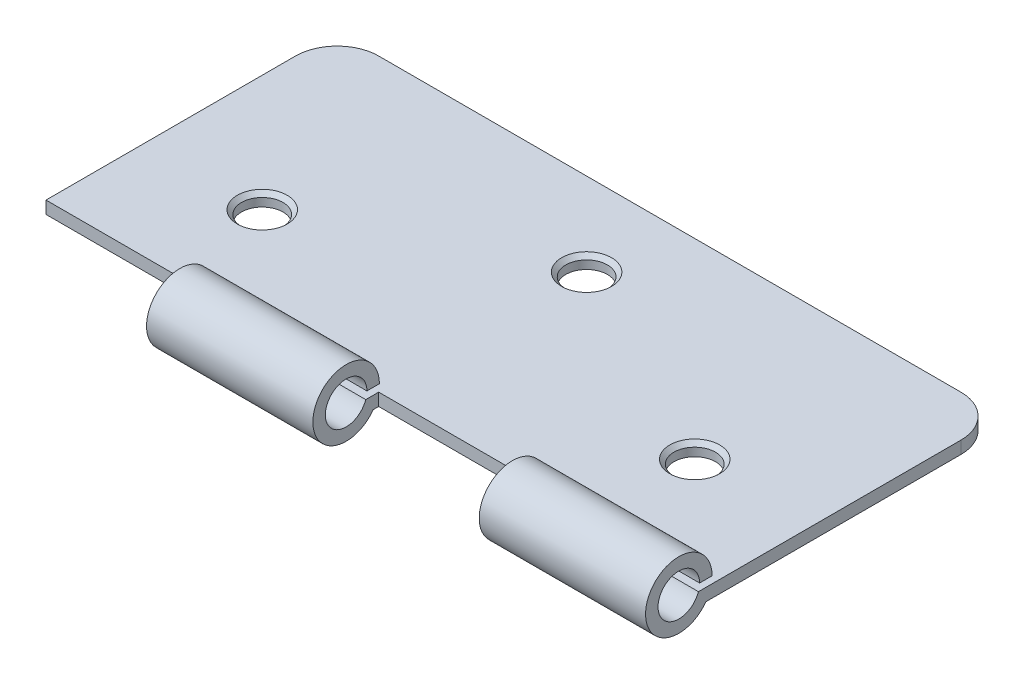
ISO-10303-21;
HEADER;
FILE_DESCRIPTION(('STEP AP214'),'2;1');
FILE_NAME('part.step','',(''),(''),'','','');
FILE_SCHEMA(('AUTOMOTIVE_DESIGN { 1 0 10303 214 1 1 1 1 }'));
ENDSEC;
DATA;
#1=APPLICATION_CONTEXT('core data for automotive mechanical design processes');
#2=APPLICATION_PROTOCOL_DEFINITION('international standard','automotive_design',2000,#1);
#3=PRODUCT_CONTEXT('',#1,'mechanical');
#4=PRODUCT('Part','Part','',(#3));
#5=PRODUCT_RELATED_PRODUCT_CATEGORY('part','',(#4));
#6=PRODUCT_DEFINITION_FORMATION('','',#4);
#7=PRODUCT_DEFINITION_CONTEXT('part definition',#1,'design');
#8=PRODUCT_DEFINITION('design','',#6,#7);
#9=PRODUCT_DEFINITION_SHAPE('','',#8);
#10=(LENGTH_UNIT() NAMED_UNIT(*) SI_UNIT(.MILLI.,.METRE.));
#11=(NAMED_UNIT(*) PLANE_ANGLE_UNIT() SI_UNIT($,.RADIAN.));
#12=(NAMED_UNIT(*) SI_UNIT($,.STERADIAN.) SOLID_ANGLE_UNIT());
#13=UNCERTAINTY_MEASURE_WITH_UNIT(LENGTH_MEASURE(1.E-05),#10,'distance_accuracy_value','');
#14=(GEOMETRIC_REPRESENTATION_CONTEXT(3) GLOBAL_UNCERTAINTY_ASSIGNED_CONTEXT((#13)) GLOBAL_UNIT_ASSIGNED_CONTEXT((#10,
#11,#12)) REPRESENTATION_CONTEXT('',''));
#15=CARTESIAN_POINT('',(0.,0.,0.));
#16=DIRECTION('',(0.,0.,1.));
#17=DIRECTION('',(1.,0.,0.));
#18=AXIS2_PLACEMENT_3D('',#15,#16,#17);
#19=CARTESIAN_POINT('',(-40.,1.5,17.5));
#20=DIRECTION('',(0.,0.,-1.));
#21=DIRECTION('',(-1.,0.,0.));
#22=AXIS2_PLACEMENT_3D('',#19,#20,#21);
#23=PLANE('',#22);
#24=DIRECTION('',(0.,1.,0.));
#25=VECTOR('',#24,1.);
#26=CARTESIAN_POINT('',(-20.,0.,17.5));
#27=LINE('',#26,#25);
#28=CARTESIAN_POINT('',(-20.,0.,17.5));
#29=VERTEX_POINT('',#28);
#30=CARTESIAN_POINT('',(-20.,1.5,17.5));
#31=VERTEX_POINT('',#30);
#32=EDGE_CURVE('E61',#29,#31,#27,.T.);
#33=ORIENTED_EDGE('',*,*,#32,.T.);
#34=DIRECTION('',(1.,0.,0.));
#35=VECTOR('',#34,1.);
#36=CARTESIAN_POINT('',(-40.,1.5,17.5));
#37=LINE('',#36,#35);
#38=CARTESIAN_POINT('',(-40.,1.5,17.5));
#39=VERTEX_POINT('',#38);
#40=EDGE_CURVE('E176',#39,#31,#37,.T.);
#41=ORIENTED_EDGE('',*,*,#40,.F.);
#42=DIRECTION('',(0.,-1.,0.));
#43=VECTOR('',#42,1.);
#44=CARTESIAN_POINT('',(-40.,1.5,17.5));
#45=LINE('',#44,#43);
#46=CARTESIAN_POINT('',(-40.,0.,17.5));
#47=VERTEX_POINT('',#46);
#48=EDGE_CURVE('E256',#39,#47,#45,.T.);
#49=ORIENTED_EDGE('',*,*,#48,.T.);
#50=DIRECTION('',(1.,0.,0.));
#51=VECTOR('',#50,1.);
#52=CARTESIAN_POINT('',(-40.,0.,17.5));
#53=LINE('',#52,#51);
#54=EDGE_CURVE('E247',#47,#29,#53,.T.);
#55=ORIENTED_EDGE('',*,*,#54,.T.);
#56=EDGE_LOOP('',(#33,#41,#49,#55));
#57=FACE_BOUND('',#56,.T.);
#58=ADVANCED_FACE('F37',(#57),#23,.F.);
#59=CARTESIAN_POINT('',(0.,1.5,17.5));
#60=VERTEX_POINT('',#59);
#61=CARTESIAN_POINT('',(20.,1.5,17.5));
#62=VERTEX_POINT('',#61);
#63=EDGE_CURVE('E53',#60,#62,#37,.T.);
#64=ORIENTED_EDGE('',*,*,#63,.F.);
#65=DIRECTION('',(0.,1.,0.));
#66=VECTOR('',#65,1.);
#67=CARTESIAN_POINT('',(0.,0.,17.5));
#68=LINE('',#67,#66);
#69=CARTESIAN_POINT('',(0.,0.,17.5));
#70=VERTEX_POINT('',#69);
#71=EDGE_CURVE('E187',#70,#60,#68,.T.);
#72=ORIENTED_EDGE('',*,*,#71,.F.);
#73=CARTESIAN_POINT('',(20.,0.,17.5));
#74=VERTEX_POINT('',#73);
#75=EDGE_CURVE('E267',#70,#74,#53,.T.);
#76=ORIENTED_EDGE('',*,*,#75,.T.);
#77=DIRECTION('',(0.,1.,0.));
#78=VECTOR('',#77,1.);
#79=CARTESIAN_POINT('',(20.,0.,17.5));
#80=LINE('',#79,#78);
#81=EDGE_CURVE('E208',#74,#62,#80,.T.);
#82=ORIENTED_EDGE('',*,*,#81,.T.);
#83=EDGE_LOOP('',(#64,#72,#76,#82));
#84=FACE_BOUND('',#83,.T.);
#85=ADVANCED_FACE('F322',(#84),#23,.F.);
#86=CARTESIAN_POINT('',(40.,1.5,-12.5));
#87=DIRECTION('',(-1.,0.,0.));
#88=DIRECTION('',(0.,0.,1.));
#89=AXIS2_PLACEMENT_3D('',#86,#87,#88);
#90=PLANE('',#89);
#91=DIRECTION('',(0.,0.,-1.));
#92=VECTOR('',#91,1.);
#93=CARTESIAN_POINT('',(40.,0.,-12.5));
#94=LINE('',#93,#92);
#95=CARTESIAN_POINT('',(40.,0.,18.1615382727363));
#96=VERTEX_POINT('',#95);
#97=CARTESIAN_POINT('',(40.,0.,-12.5));
#98=VERTEX_POINT('',#97);
#99=EDGE_CURVE('E237',#96,#98,#94,.T.);
#100=ORIENTED_EDGE('',*,*,#99,.T.);
#101=DIRECTION('',(0.,-1.,0.));
#102=VECTOR('',#101,1.);
#103=CARTESIAN_POINT('',(40.,1.5,-12.5));
#104=LINE('',#103,#102);
#105=CARTESIAN_POINT('',(40.,1.5,-12.5));
#106=VERTEX_POINT('',#105);
#107=EDGE_CURVE('E280',#106,#98,#104,.T.);
#108=ORIENTED_EDGE('',*,*,#107,.F.);
#109=DIRECTION('',(0.,0.,-1.));
#110=VECTOR('',#109,1.);
#111=CARTESIAN_POINT('',(40.,1.5,-12.5));
#112=LINE('',#111,#110);
#113=CARTESIAN_POINT('',(40.,1.5,19.0547197125745));
#114=VERTEX_POINT('',#113);
#115=EDGE_CURVE('E244',#114,#106,#112,.T.);
#116=ORIENTED_EDGE('',*,*,#115,.F.);
#117=CARTESIAN_POINT('',(40.,2.3298434276009,21.4129732794472));
#118=DIRECTION('',(-1.,0.,0.));
#119=DIRECTION('',(0.,0.,-1.));
#120=AXIS2_PLACEMENT_3D('',#117,#118,#119);
#121=CIRCLE('',#120,2.5);
#122=CARTESIAN_POINT('',(40.,2.3298434276009,18.9129732794472));
#123=VERTEX_POINT('',#122);
#124=EDGE_CURVE('E204',#114,#123,#121,.T.);
#125=ORIENTED_EDGE('',*,*,#124,.T.);
#126=DIRECTION('',(0.,0.,-1.));
#127=VECTOR('',#126,1.);
#128=CARTESIAN_POINT('',(40.,2.3298434276009,18.9129732794472));
#129=LINE('',#128,#127);
#130=CARTESIAN_POINT('',(40.,2.3298434276009,17.4129732794472));
#131=VERTEX_POINT('',#130);
#132=EDGE_CURVE('E229',#123,#131,#129,.T.);
#133=ORIENTED_EDGE('',*,*,#132,.T.);
#134=CARTESIAN_POINT('',(40.,2.3298434276009,21.4129732794472));
#135=DIRECTION('',(1.,0.,0.));
#136=DIRECTION('',(0.,0.,-1.));
#137=AXIS2_PLACEMENT_3D('',#134,#135,#136);
#138=CIRCLE('',#137,4.);
#139=EDGE_CURVE('E211',#131,#96,#138,.T.);
#140=ORIENTED_EDGE('',*,*,#139,.T.);
#141=EDGE_LOOP('',(#100,#108,#116,#125,#133,#140));
#142=FACE_BOUND('',#141,.T.);
#143=ADVANCED_FACE('F327',(#142),#90,.F.);
#144=CARTESIAN_POINT('',(35.,1.5,-12.5));
#145=DIRECTION('',(0.,-1.,0.));
#146=DIRECTION('',(0.,0.,-1.));
#147=AXIS2_PLACEMENT_3D('',#144,#145,#146);
#148=CYLINDRICAL_SURFACE('',#147,5.);
#149=CARTESIAN_POINT('',(35.,0.,-12.5));
#150=DIRECTION('',(0.,1.,0.));
#151=DIRECTION('',(0.,0.,-1.));
#152=AXIS2_PLACEMENT_3D('',#149,#150,#151);
#153=CIRCLE('',#152,5.);
#154=CARTESIAN_POINT('',(35.,0.,-17.5));
#155=VERTEX_POINT('',#154);
#156=EDGE_CURVE('E259',#98,#155,#153,.T.);
#157=ORIENTED_EDGE('',*,*,#156,.T.);
#158=DIRECTION('',(0.,-1.,0.));
#159=VECTOR('',#158,1.);
#160=CARTESIAN_POINT('',(35.,1.5,-17.5));
#161=LINE('',#160,#159);
#162=CARTESIAN_POINT('',(35.,1.5,-17.5));
#163=VERTEX_POINT('',#162);
#164=EDGE_CURVE('E277',#163,#155,#161,.T.);
#165=ORIENTED_EDGE('',*,*,#164,.F.);
#166=CARTESIAN_POINT('',(35.,1.5,-12.5));
#167=DIRECTION('',(0.,1.,0.));
#168=DIRECTION('',(0.,0.,-1.));
#169=AXIS2_PLACEMENT_3D('',#166,#167,#168);
#170=CIRCLE('',#169,5.);
#171=EDGE_CURVE('E246',#106,#163,#170,.T.);
#172=ORIENTED_EDGE('',*,*,#171,.F.);
#173=ORIENTED_EDGE('',*,*,#107,.T.);
#174=EDGE_LOOP('',(#157,#165,#172,#173));
#175=FACE_BOUND('',#174,.T.);
#176=ADVANCED_FACE('F343',(#175),#148,.T.);
#177=CARTESIAN_POINT('',(-35.,1.5,-17.5));
#178=DIRECTION('',(0.,0.,1.));
#179=DIRECTION('',(1.,0.,0.));
#180=AXIS2_PLACEMENT_3D('',#177,#178,#179);
#181=PLANE('',#180);
#182=DIRECTION('',(-1.,0.,0.));
#183=VECTOR('',#182,1.);
#184=CARTESIAN_POINT('',(-35.,0.,-17.5));
#185=LINE('',#184,#183);
#186=CARTESIAN_POINT('',(-35.,0.,-17.5));
#187=VERTEX_POINT('',#186);
#188=EDGE_CURVE('E261',#155,#187,#185,.T.);
#189=ORIENTED_EDGE('',*,*,#188,.T.);
#190=DIRECTION('',(0.,-1.,0.));
#191=VECTOR('',#190,1.);
#192=CARTESIAN_POINT('',(-35.,1.5,-17.5));
#193=LINE('',#192,#191);
#194=CARTESIAN_POINT('',(-35.,1.5,-17.5));
#195=VERTEX_POINT('',#194);
#196=EDGE_CURVE('E274',#195,#187,#193,.T.);
#197=ORIENTED_EDGE('',*,*,#196,.F.);
#198=DIRECTION('',(-1.,0.,0.));
#199=VECTOR('',#198,1.);
#200=CARTESIAN_POINT('',(-35.,1.5,-17.5));
#201=LINE('',#200,#199);
#202=EDGE_CURVE('E249',#163,#195,#201,.T.);
#203=ORIENTED_EDGE('',*,*,#202,.F.);
#204=ORIENTED_EDGE('',*,*,#164,.T.);
#205=EDGE_LOOP('',(#189,#197,#203,#204));
#206=FACE_BOUND('',#205,.T.);
#207=ADVANCED_FACE('F339',(#206),#181,.F.);
#208=CARTESIAN_POINT('',(-35.,1.5,-12.5));
#209=DIRECTION('',(0.,-1.,0.));
#210=DIRECTION('',(0.,0.,-1.));
#211=AXIS2_PLACEMENT_3D('',#208,#209,#210);
#212=CYLINDRICAL_SURFACE('',#211,5.);
#213=CARTESIAN_POINT('',(-35.,0.,-12.5));
#214=DIRECTION('',(0.,1.,0.));
#215=DIRECTION('',(0.,0.,1.));
#216=AXIS2_PLACEMENT_3D('',#213,#214,#215);
#217=CIRCLE('',#216,5.);
#218=CARTESIAN_POINT('',(-40.,0.,-12.5));
#219=VERTEX_POINT('',#218);
#220=EDGE_CURVE('E263',#187,#219,#217,.T.);
#221=ORIENTED_EDGE('',*,*,#220,.T.);
#222=DIRECTION('',(0.,-1.,0.));
#223=VECTOR('',#222,1.);
#224=CARTESIAN_POINT('',(-40.,1.5,-12.5));
#225=LINE('',#224,#223);
#226=CARTESIAN_POINT('',(-40.,1.5,-12.5));
#227=VERTEX_POINT('',#226);
#228=EDGE_CURVE('E271',#227,#219,#225,.T.);
#229=ORIENTED_EDGE('',*,*,#228,.F.);
#230=CARTESIAN_POINT('',(-35.,1.5,-12.5));
#231=DIRECTION('',(0.,1.,0.));
#232=DIRECTION('',(0.,0.,1.));
#233=AXIS2_PLACEMENT_3D('',#230,#231,#232);
#234=CIRCLE('',#233,5.);
#235=EDGE_CURVE('E251',#195,#227,#234,.T.);
#236=ORIENTED_EDGE('',*,*,#235,.F.);
#237=ORIENTED_EDGE('',*,*,#196,.T.);
#238=EDGE_LOOP('',(#221,#229,#236,#237));
#239=FACE_BOUND('',#238,.T.);
#240=ADVANCED_FACE('F335',(#239),#212,.T.);
#241=CARTESIAN_POINT('',(-40.,1.5,-12.5));
#242=DIRECTION('',(1.,0.,0.));
#243=DIRECTION('',(0.,0.,-1.));
#244=AXIS2_PLACEMENT_3D('',#241,#242,#243);
#245=PLANE('',#244);
#246=DIRECTION('',(0.,0.,1.));
#247=VECTOR('',#246,1.);
#248=CARTESIAN_POINT('',(-40.,0.,-12.5));
#249=LINE('',#248,#247);
#250=EDGE_CURVE('E265',#219,#47,#249,.T.);
#251=ORIENTED_EDGE('',*,*,#250,.T.);
#252=ORIENTED_EDGE('',*,*,#48,.F.);
#253=DIRECTION('',(0.,0.,1.));
#254=VECTOR('',#253,1.);
#255=CARTESIAN_POINT('',(-40.,1.5,-12.5));
#256=LINE('',#255,#254);
#257=EDGE_CURVE('E253',#227,#39,#256,.T.);
#258=ORIENTED_EDGE('',*,*,#257,.F.);
#259=ORIENTED_EDGE('',*,*,#228,.T.);
#260=EDGE_LOOP('',(#251,#252,#258,#259));
#261=FACE_BOUND('',#260,.T.);
#262=ADVANCED_FACE('F332',(#261),#245,.F.);
#263=CARTESIAN_POINT('',(-35.,1.5,-12.5));
#264=DIRECTION('',(0.,1.,0.));
#265=DIRECTION('',(0.,0.,1.));
#266=AXIS2_PLACEMENT_3D('',#263,#264,#265);
#267=PLANE('',#266);
#268=CARTESIAN_POINT('',(-26.,1.5,5.5));
#269=DIRECTION('',(0.,1.,0.));
#270=DIRECTION('',(0.,0.,1.));
#271=AXIS2_PLACEMENT_3D('',#268,#269,#270);
#272=CIRCLE('',#271,3.);
#273=CARTESIAN_POINT('',(-26.,1.5,8.5));
#274=VERTEX_POINT('',#273);
#275=EDGE_CURVE('E300',#274,#274,#272,.F.);
#276=ORIENTED_EDGE('',*,*,#275,.T.);
#277=EDGE_LOOP('',(#276));
#278=FACE_BOUND('',#277,.T.);
#279=CARTESIAN_POINT('',(0.,1.5,-7.5));
#280=DIRECTION('',(0.,1.,0.));
#281=DIRECTION('',(0.,0.,1.));
#282=AXIS2_PLACEMENT_3D('',#279,#280,#281);
#283=CIRCLE('',#282,3.00000000000002);
#284=CARTESIAN_POINT('',(0.,1.5,-4.49999999999999));
#285=VERTEX_POINT('',#284);
#286=EDGE_CURVE('E297',#285,#285,#283,.F.);
#287=ORIENTED_EDGE('',*,*,#286,.T.);
#288=EDGE_LOOP('',(#287));
#289=FACE_BOUND('',#288,.T.);
#290=CARTESIAN_POINT('',(26.,1.5,5.5));
#291=DIRECTION('',(0.,1.,0.));
#292=DIRECTION('',(0.,0.,1.));
#293=AXIS2_PLACEMENT_3D('',#290,#291,#292);
#294=CIRCLE('',#293,3.);
#295=CARTESIAN_POINT('',(26.,1.5,8.5));
#296=VERTEX_POINT('',#295);
#297=EDGE_CURVE('E294',#296,#296,#294,.F.);
#298=ORIENTED_EDGE('',*,*,#297,.T.);
#299=EDGE_LOOP('',(#298));
#300=FACE_BOUND('',#299,.T.);
#301=ORIENTED_EDGE('',*,*,#115,.T.);
#302=ORIENTED_EDGE('',*,*,#171,.T.);
#303=ORIENTED_EDGE('',*,*,#202,.T.);
#304=ORIENTED_EDGE('',*,*,#235,.T.);
#305=ORIENTED_EDGE('',*,*,#257,.T.);
#306=ORIENTED_EDGE('',*,*,#40,.T.);
#307=DIRECTION('',(0.,0.,1.));
#308=VECTOR('',#307,1.);
#309=CARTESIAN_POINT('',(-20.,1.5,17.5));
#310=LINE('',#309,#308);
#311=CARTESIAN_POINT('',(-20.,1.5,19.0547197125745));
#312=VERTEX_POINT('',#311);
#313=EDGE_CURVE('E169',#31,#312,#310,.T.);
#314=ORIENTED_EDGE('',*,*,#313,.T.);
#315=DIRECTION('',(1.,0.,0.));
#316=VECTOR('',#315,1.);
#317=CARTESIAN_POINT('',(-20.,1.5,19.0547197125745));
#318=LINE('',#317,#316);
#319=CARTESIAN_POINT('',(0.,1.5,19.0547197125745));
#320=VERTEX_POINT('',#319);
#321=EDGE_CURVE('E153',#312,#320,#318,.T.);
#322=ORIENTED_EDGE('',*,*,#321,.T.);
#323=DIRECTION('',(0.,0.,1.));
#324=VECTOR('',#323,1.);
#325=CARTESIAN_POINT('',(0.,1.5,17.5));
#326=LINE('',#325,#324);
#327=EDGE_CURVE('E190',#60,#320,#326,.T.);
#328=ORIENTED_EDGE('',*,*,#327,.F.);
#329=ORIENTED_EDGE('',*,*,#63,.T.);
#330=DIRECTION('',(0.,0.,1.));
#331=VECTOR('',#330,1.);
#332=CARTESIAN_POINT('',(20.,1.5,17.5));
#333=LINE('',#332,#331);
#334=CARTESIAN_POINT('',(20.,1.5,19.0547197125745));
#335=VERTEX_POINT('',#334);
#336=EDGE_CURVE('E210',#62,#335,#333,.T.);
#337=ORIENTED_EDGE('',*,*,#336,.T.);
#338=DIRECTION('',(1.,0.,0.));
#339=VECTOR('',#338,1.);
#340=CARTESIAN_POINT('',(20.,1.5,19.0547197125745));
#341=LINE('',#340,#339);
#342=EDGE_CURVE('E226',#335,#114,#341,.T.);
#343=ORIENTED_EDGE('',*,*,#342,.T.);
#344=EDGE_LOOP('',(#301,#302,#303,#304,#305,#306,#314,#322,#328,#329,#337,#343));
#345=FACE_BOUND('',#344,.T.);
#346=ADVANCED_FACE('F175',(#278,#289,#300,#345),#267,.T.);
#347=CARTESIAN_POINT('',(-35.,0.,-12.5));
#348=DIRECTION('',(0.,1.,0.));
#349=DIRECTION('',(0.,0.,1.));
#350=AXIS2_PLACEMENT_3D('',#347,#348,#349);
#351=PLANE('',#350);
#352=CARTESIAN_POINT('',(0.,0.,-7.5));
#353=DIRECTION('',(0.,1.,0.));
#354=DIRECTION('',(0.,0.,1.));
#355=AXIS2_PLACEMENT_3D('',#352,#353,#354);
#356=CIRCLE('',#355,2.5);
#357=CARTESIAN_POINT('',(0.,0.,-5.));
#358=VERTEX_POINT('',#357);
#359=EDGE_CURVE('E191',#358,#358,#356,.T.);
#360=ORIENTED_EDGE('',*,*,#359,.T.);
#361=EDGE_LOOP('',(#360));
#362=FACE_BOUND('',#361,.T.);
#363=CARTESIAN_POINT('',(-26.,0.,5.5));
#364=DIRECTION('',(0.,1.,0.));
#365=DIRECTION('',(0.,0.,1.));
#366=AXIS2_PLACEMENT_3D('',#363,#364,#365);
#367=CIRCLE('',#366,2.5);
#368=CARTESIAN_POINT('',(-26.,0.,8.));
#369=VERTEX_POINT('',#368);
#370=EDGE_CURVE('E287',#369,#369,#367,.T.);
#371=ORIENTED_EDGE('',*,*,#370,.T.);
#372=EDGE_LOOP('',(#371));
#373=FACE_BOUND('',#372,.T.);
#374=CARTESIAN_POINT('',(26.,0.,5.5));
#375=DIRECTION('',(0.,1.,0.));
#376=DIRECTION('',(0.,0.,1.));
#377=AXIS2_PLACEMENT_3D('',#374,#375,#376);
#378=CIRCLE('',#377,2.5);
#379=CARTESIAN_POINT('',(26.,0.,8.));
#380=VERTEX_POINT('',#379);
#381=EDGE_CURVE('E284',#380,#380,#378,.T.);
#382=ORIENTED_EDGE('',*,*,#381,.T.);
#383=EDGE_LOOP('',(#382));
#384=FACE_BOUND('',#383,.T.);
#385=ORIENTED_EDGE('',*,*,#99,.F.);
#386=DIRECTION('',(1.,0.,0.));
#387=VECTOR('',#386,1.);
#388=CARTESIAN_POINT('',(20.,0.,18.1615382727363));
#389=LINE('',#388,#387);
#390=CARTESIAN_POINT('',(20.,0.,18.1615382727363));
#391=VERTEX_POINT('',#390);
#392=EDGE_CURVE('E234',#391,#96,#389,.T.);
#393=ORIENTED_EDGE('',*,*,#392,.F.);
#394=DIRECTION('',(0.,0.,-1.));
#395=VECTOR('',#394,1.);
#396=CARTESIAN_POINT('',(20.,0.,17.5));
#397=LINE('',#396,#395);
#398=EDGE_CURVE('E223',#391,#74,#397,.T.);
#399=ORIENTED_EDGE('',*,*,#398,.T.);
#400=ORIENTED_EDGE('',*,*,#75,.F.);
#401=DIRECTION('',(0.,0.,-1.));
#402=VECTOR('',#401,1.);
#403=CARTESIAN_POINT('',(0.,0.,17.5));
#404=LINE('',#403,#402);
#405=CARTESIAN_POINT('',(0.,0.,18.1615382727363));
#406=VERTEX_POINT('',#405);
#407=EDGE_CURVE('E178',#406,#70,#404,.T.);
#408=ORIENTED_EDGE('',*,*,#407,.F.);
#409=DIRECTION('',(1.,0.,0.));
#410=VECTOR('',#409,1.);
#411=CARTESIAN_POINT('',(-20.,0.,18.1615382727363));
#412=LINE('',#411,#410);
#413=CARTESIAN_POINT('',(-20.,0.,18.1615382727363));
#414=VERTEX_POINT('',#413);
#415=EDGE_CURVE('E202',#414,#406,#412,.T.);
#416=ORIENTED_EDGE('',*,*,#415,.F.);
#417=DIRECTION('',(0.,0.,-1.));
#418=VECTOR('',#417,1.);
#419=CARTESIAN_POINT('',(-20.,0.,17.5));
#420=LINE('',#419,#418);
#421=EDGE_CURVE('E163',#414,#29,#420,.T.);
#422=ORIENTED_EDGE('',*,*,#421,.T.);
#423=ORIENTED_EDGE('',*,*,#54,.F.);
#424=ORIENTED_EDGE('',*,*,#250,.F.);
#425=ORIENTED_EDGE('',*,*,#220,.F.);
#426=ORIENTED_EDGE('',*,*,#188,.F.);
#427=ORIENTED_EDGE('',*,*,#156,.F.);
#428=EDGE_LOOP('',(#385,#393,#399,#400,#408,#416,#422,#423,#424,#425,#426,#427));
#429=FACE_BOUND('',#428,.T.);
#430=ADVANCED_FACE('F330',(#362,#373,#384,#429),#351,.F.);
#431=CARTESIAN_POINT('',(20.,2.3298434276009,21.4129732794472));
#432=DIRECTION('',(1.,0.,0.));
#433=DIRECTION('',(0.,0.,-1.));
#434=AXIS2_PLACEMENT_3D('',#431,#432,#433);
#435=CYLINDRICAL_SURFACE('',#434,4.);
#436=ORIENTED_EDGE('',*,*,#139,.F.);
#437=DIRECTION('',(1.,0.,0.));
#438=VECTOR('',#437,1.);
#439=CARTESIAN_POINT('',(20.,2.3298434276009,17.4129732794472));
#440=LINE('',#439,#438);
#441=CARTESIAN_POINT('',(20.,2.3298434276009,17.4129732794472));
#442=VERTEX_POINT('',#441);
#443=EDGE_CURVE('E238',#442,#131,#440,.T.);
#444=ORIENTED_EDGE('',*,*,#443,.F.);
#445=CARTESIAN_POINT('',(20.,2.3298434276009,21.4129732794472));
#446=DIRECTION('',(1.,0.,0.));
#447=DIRECTION('',(0.,0.,-1.));
#448=AXIS2_PLACEMENT_3D('',#445,#446,#447);
#449=CIRCLE('',#448,4.);
#450=EDGE_CURVE('E220',#442,#391,#449,.T.);
#451=ORIENTED_EDGE('',*,*,#450,.T.);
#452=ORIENTED_EDGE('',*,*,#392,.T.);
#453=EDGE_LOOP('',(#436,#444,#451,#452));
#454=FACE_BOUND('',#453,.T.);
#455=ADVANCED_FACE('F364',(#454),#435,.T.);
#456=CARTESIAN_POINT('',(20.,2.3298434276009,18.9129732794472));
#457=DIRECTION('',(0.,-1.,0.));
#458=DIRECTION('',(0.,0.,-1.));
#459=AXIS2_PLACEMENT_3D('',#456,#457,#458);
#460=PLANE('',#459);
#461=ORIENTED_EDGE('',*,*,#132,.F.);
#462=DIRECTION('',(1.,0.,0.));
#463=VECTOR('',#462,1.);
#464=CARTESIAN_POINT('',(20.,2.3298434276009,18.9129732794472));
#465=LINE('',#464,#463);
#466=CARTESIAN_POINT('',(20.,2.3298434276009,18.9129732794472));
#467=VERTEX_POINT('',#466);
#468=EDGE_CURVE('E240',#467,#123,#465,.T.);
#469=ORIENTED_EDGE('',*,*,#468,.F.);
#470=DIRECTION('',(0.,0.,-1.));
#471=VECTOR('',#470,1.);
#472=CARTESIAN_POINT('',(20.,2.3298434276009,18.9129732794472));
#473=LINE('',#472,#471);
#474=EDGE_CURVE('E217',#467,#442,#473,.T.);
#475=ORIENTED_EDGE('',*,*,#474,.T.);
#476=ORIENTED_EDGE('',*,*,#443,.T.);
#477=EDGE_LOOP('',(#461,#469,#475,#476));
#478=FACE_BOUND('',#477,.T.);
#479=ADVANCED_FACE('F391',(#478),#460,.T.);
#480=CARTESIAN_POINT('',(20.,2.3298434276009,21.4129732794472));
#481=DIRECTION('',(1.,0.,0.));
#482=DIRECTION('',(0.,0.,-1.));
#483=AXIS2_PLACEMENT_3D('',#480,#481,#482);
#484=CYLINDRICAL_SURFACE('',#483,2.5);
#485=ORIENTED_EDGE('',*,*,#124,.F.);
#486=ORIENTED_EDGE('',*,*,#342,.F.);
#487=CARTESIAN_POINT('',(20.,2.3298434276009,21.4129732794472));
#488=DIRECTION('',(-1.,0.,0.));
#489=DIRECTION('',(0.,0.,-1.));
#490=AXIS2_PLACEMENT_3D('',#487,#488,#489);
#491=CIRCLE('',#490,2.5);
#492=EDGE_CURVE('E214',#335,#467,#491,.T.);
#493=ORIENTED_EDGE('',*,*,#492,.T.);
#494=ORIENTED_EDGE('',*,*,#468,.T.);
#495=EDGE_LOOP('',(#485,#486,#493,#494));
#496=FACE_BOUND('',#495,.T.);
#497=ADVANCED_FACE('F387',(#496),#484,.F.);
#498=CARTESIAN_POINT('',(20.,2.3298434276009,21.4129732794472));
#499=DIRECTION('',(1.,0.,0.));
#500=DIRECTION('',(0.,0.,-1.));
#501=AXIS2_PLACEMENT_3D('',#498,#499,#500);
#502=PLANE('',#501);
#503=ORIENTED_EDGE('',*,*,#81,.F.);
#504=ORIENTED_EDGE('',*,*,#398,.F.);
#505=ORIENTED_EDGE('',*,*,#450,.F.);
#506=ORIENTED_EDGE('',*,*,#474,.F.);
#507=ORIENTED_EDGE('',*,*,#492,.F.);
#508=ORIENTED_EDGE('',*,*,#336,.F.);
#509=EDGE_LOOP('',(#503,#504,#505,#506,#507,#508));
#510=FACE_BOUND('',#509,.T.);
#511=ADVANCED_FACE('F370',(#510),#502,.F.);
#512=CARTESIAN_POINT('',(-20.,2.3298434276009,21.4129732794472));
#513=DIRECTION('',(1.,0.,0.));
#514=DIRECTION('',(0.,0.,-1.));
#515=AXIS2_PLACEMENT_3D('',#512,#513,#514);
#516=CYLINDRICAL_SURFACE('',#515,4.);
#517=CARTESIAN_POINT('',(0.,2.3298434276009,21.4129732794472));
#518=DIRECTION('',(1.,0.,0.));
#519=DIRECTION('',(0.,0.,-1.));
#520=AXIS2_PLACEMENT_3D('',#517,#518,#519);
#521=CIRCLE('',#520,4.);
#522=CARTESIAN_POINT('',(0.,2.3298434276009,17.4129732794472));
#523=VERTEX_POINT('',#522);
#524=EDGE_CURVE('E197',#523,#406,#521,.T.);
#525=ORIENTED_EDGE('',*,*,#524,.F.);
#526=DIRECTION('',(1.,0.,0.));
#527=VECTOR('',#526,1.);
#528=CARTESIAN_POINT('',(-20.,2.3298434276009,17.4129732794472));
#529=LINE('',#528,#527);
#530=CARTESIAN_POINT('',(-20.,2.3298434276009,17.4129732794472));
#531=VERTEX_POINT('',#530);
#532=EDGE_CURVE('E205',#531,#523,#529,.T.);
#533=ORIENTED_EDGE('',*,*,#532,.F.);
#534=CARTESIAN_POINT('',(-20.,2.3298434276009,21.4129732794472));
#535=DIRECTION('',(1.,0.,0.));
#536=DIRECTION('',(0.,0.,-1.));
#537=AXIS2_PLACEMENT_3D('',#534,#535,#536);
#538=CIRCLE('',#537,4.);
#539=EDGE_CURVE('E182',#531,#414,#538,.T.);
#540=ORIENTED_EDGE('',*,*,#539,.T.);
#541=ORIENTED_EDGE('',*,*,#415,.T.);
#542=EDGE_LOOP('',(#525,#533,#540,#541));
#543=FACE_BOUND('',#542,.T.);
#544=ADVANCED_FACE('F378',(#543),#516,.T.);
#545=CARTESIAN_POINT('',(-20.,2.3298434276009,18.9129732794472));
#546=DIRECTION('',(0.,-1.,0.));
#547=DIRECTION('',(0.,0.,-1.));
#548=AXIS2_PLACEMENT_3D('',#545,#546,#547);
#549=PLANE('',#548);
#550=DIRECTION('',(0.,0.,-1.));
#551=VECTOR('',#550,1.);
#552=CARTESIAN_POINT('',(0.,2.3298434276009,18.9129732794472));
#553=LINE('',#552,#551);
#554=CARTESIAN_POINT('',(0.,2.3298434276009,18.9129732794472));
#555=VERTEX_POINT('',#554);
#556=EDGE_CURVE('E194',#555,#523,#553,.T.);
#557=ORIENTED_EDGE('',*,*,#556,.F.);
#558=DIRECTION('',(1.,0.,0.));
#559=VECTOR('',#558,1.);
#560=CARTESIAN_POINT('',(-20.,2.3298434276009,18.9129732794472));
#561=LINE('',#560,#559);
#562=CARTESIAN_POINT('',(-20.,2.3298434276009,18.9129732794472));
#563=VERTEX_POINT('',#562);
#564=EDGE_CURVE('E162',#563,#555,#561,.T.);
#565=ORIENTED_EDGE('',*,*,#564,.F.);
#566=DIRECTION('',(0.,0.,-1.));
#567=VECTOR('',#566,1.);
#568=CARTESIAN_POINT('',(-20.,2.3298434276009,18.9129732794472));
#569=LINE('',#568,#567);
#570=EDGE_CURVE('E172',#563,#531,#569,.T.);
#571=ORIENTED_EDGE('',*,*,#570,.T.);
#572=ORIENTED_EDGE('',*,*,#532,.T.);
#573=EDGE_LOOP('',(#557,#565,#571,#572));
#574=FACE_BOUND('',#573,.T.);
#575=ADVANCED_FACE('F383',(#574),#549,.T.);
#576=CARTESIAN_POINT('',(-20.,2.3298434276009,21.4129732794472));
#577=DIRECTION('',(1.,0.,0.));
#578=DIRECTION('',(0.,0.,-1.));
#579=AXIS2_PLACEMENT_3D('',#576,#577,#578);
#580=CYLINDRICAL_SURFACE('',#579,2.5);
#581=CARTESIAN_POINT('',(0.,2.3298434276009,21.4129732794472));
#582=DIRECTION('',(-1.,0.,0.));
#583=DIRECTION('',(0.,0.,-1.));
#584=AXIS2_PLACEMENT_3D('',#581,#582,#583);
#585=CIRCLE('',#584,2.5);
#586=EDGE_CURVE('E158',#320,#555,#585,.T.);
#587=ORIENTED_EDGE('',*,*,#586,.F.);
#588=ORIENTED_EDGE('',*,*,#321,.F.);
#589=CARTESIAN_POINT('',(-20.,2.3298434276009,21.4129732794472));
#590=DIRECTION('',(-1.,0.,0.));
#591=DIRECTION('',(0.,0.,-1.));
#592=AXIS2_PLACEMENT_3D('',#589,#590,#591);
#593=CIRCLE('',#592,2.5);
#594=EDGE_CURVE('E156',#312,#563,#593,.T.);
#595=ORIENTED_EDGE('',*,*,#594,.T.);
#596=ORIENTED_EDGE('',*,*,#564,.T.);
#597=EDGE_LOOP('',(#587,#588,#595,#596));
#598=FACE_BOUND('',#597,.T.);
#599=ADVANCED_FACE('F155',(#598),#580,.F.);
#600=CARTESIAN_POINT('',(-20.,2.3298434276009,21.4129732794472));
#601=DIRECTION('',(1.,0.,0.));
#602=DIRECTION('',(0.,0.,-1.));
#603=AXIS2_PLACEMENT_3D('',#600,#601,#602);
#604=PLANE('',#603);
#605=ORIENTED_EDGE('',*,*,#32,.F.);
#606=ORIENTED_EDGE('',*,*,#421,.F.);
#607=ORIENTED_EDGE('',*,*,#539,.F.);
#608=ORIENTED_EDGE('',*,*,#570,.F.);
#609=ORIENTED_EDGE('',*,*,#594,.F.);
#610=ORIENTED_EDGE('',*,*,#313,.F.);
#611=EDGE_LOOP('',(#605,#606,#607,#608,#609,#610));
#612=FACE_BOUND('',#611,.T.);
#613=ADVANCED_FACE('F168',(#612),#604,.F.);
#614=CARTESIAN_POINT('',(0.,2.3298434276009,21.4129732794472));
#615=DIRECTION('',(1.,0.,0.));
#616=DIRECTION('',(0.,0.,-1.));
#617=AXIS2_PLACEMENT_3D('',#614,#615,#616);
#618=PLANE('',#617);
#619=ORIENTED_EDGE('',*,*,#71,.T.);
#620=ORIENTED_EDGE('',*,*,#327,.T.);
#621=ORIENTED_EDGE('',*,*,#586,.T.);
#622=ORIENTED_EDGE('',*,*,#556,.T.);
#623=ORIENTED_EDGE('',*,*,#524,.T.);
#624=ORIENTED_EDGE('',*,*,#407,.T.);
#625=EDGE_LOOP('',(#619,#620,#621,#622,#623,#624));
#626=FACE_BOUND('',#625,.T.);
#627=ADVANCED_FACE('F374',(#626),#618,.T.);
#628=CARTESIAN_POINT('',(26.,-18.5,5.5));
#629=DIRECTION('',(0.,1.,0.));
#630=DIRECTION('',(0.,0.,1.));
#631=AXIS2_PLACEMENT_3D('',#628,#629,#630);
#632=CYLINDRICAL_SURFACE('',#631,2.5);
#633=CARTESIAN_POINT('',(26.,1.,5.5));
#634=DIRECTION('',(0.,1.,0.));
#635=DIRECTION('',(0.,0.,1.));
#636=AXIS2_PLACEMENT_3D('',#633,#634,#635);
#637=CIRCLE('',#636,2.5);
#638=CARTESIAN_POINT('',(26.,1.,8.));
#639=VERTEX_POINT('',#638);
#640=EDGE_CURVE('E11',#639,#639,#637,.T.);
#641=ORIENTED_EDGE('',*,*,#640,.T.);
#642=EDGE_LOOP('',(#641));
#643=FACE_BOUND('',#642,.T.);
#644=ORIENTED_EDGE('',*,*,#381,.F.);
#645=EDGE_LOOP('',(#644));
#646=FACE_BOUND('',#645,.T.);
#647=ADVANCED_FACE('F414',(#643,#646),#632,.F.);
#648=CARTESIAN_POINT('',(-26.,-18.5,5.5));
#649=DIRECTION('',(0.,1.,0.));
#650=DIRECTION('',(0.,0.,1.));
#651=AXIS2_PLACEMENT_3D('',#648,#649,#650);
#652=CYLINDRICAL_SURFACE('',#651,2.5);
#653=CARTESIAN_POINT('',(-26.,1.,5.5));
#654=DIRECTION('',(0.,1.,0.));
#655=DIRECTION('',(0.,0.,1.));
#656=AXIS2_PLACEMENT_3D('',#653,#654,#655);
#657=CIRCLE('',#656,2.5);
#658=CARTESIAN_POINT('',(-26.,1.,8.));
#659=VERTEX_POINT('',#658);
#660=EDGE_CURVE('E283',#659,#659,#657,.T.);
#661=ORIENTED_EDGE('',*,*,#660,.T.);
#662=EDGE_LOOP('',(#661));
#663=FACE_BOUND('',#662,.T.);
#664=ORIENTED_EDGE('',*,*,#370,.F.);
#665=EDGE_LOOP('',(#664));
#666=FACE_BOUND('',#665,.T.);
#667=ADVANCED_FACE('F417',(#663,#666),#652,.F.);
#668=CARTESIAN_POINT('',(0.,-18.5,-7.5));
#669=DIRECTION('',(0.,1.,0.));
#670=DIRECTION('',(0.,0.,1.));
#671=AXIS2_PLACEMENT_3D('',#668,#669,#670);
#672=CYLINDRICAL_SURFACE('',#671,2.5);
#673=CARTESIAN_POINT('',(0.,0.99999999999999,-7.5));
#674=DIRECTION('',(0.,1.,0.));
#675=DIRECTION('',(0.,0.,1.));
#676=AXIS2_PLACEMENT_3D('',#673,#674,#675);
#677=CIRCLE('',#676,2.5);
#678=CARTESIAN_POINT('',(0.,0.99999999999999,-5.));
#679=VERTEX_POINT('',#678);
#680=EDGE_CURVE('E46',#679,#679,#677,.T.);
#681=ORIENTED_EDGE('',*,*,#680,.T.);
#682=EDGE_LOOP('',(#681));
#683=FACE_BOUND('',#682,.T.);
#684=ORIENTED_EDGE('',*,*,#359,.F.);
#685=EDGE_LOOP('',(#684));
#686=FACE_BOUND('',#685,.T.);
#687=ADVANCED_FACE('F305',(#683,#686),#672,.F.);
#688=CARTESIAN_POINT('',(-26.,1.,5.5));
#689=DIRECTION('',(0.,1.,0.));
#690=DIRECTION('',(0.,0.,1.));
#691=AXIS2_PLACEMENT_3D('',#688,#689,#690);
#692=CONICAL_SURFACE('',#691,2.5,0.785398163397452);
#693=ORIENTED_EDGE('',*,*,#275,.F.);
#694=EDGE_LOOP('',(#693));
#695=FACE_BOUND('',#694,.T.);
#696=ORIENTED_EDGE('',*,*,#660,.F.);
#697=EDGE_LOOP('',(#696));
#698=FACE_BOUND('',#697,.T.);
#699=ADVANCED_FACE('F310',(#695,#698),#692,.F.);
#700=CARTESIAN_POINT('',(0.,0.99999999999999,-7.5));
#701=DIRECTION('',(0.,1.,0.));
#702=DIRECTION('',(0.,0.,1.));
#703=AXIS2_PLACEMENT_3D('',#700,#701,#702);
#704=CONICAL_SURFACE('',#703,2.5,0.785398163397453);
#705=ORIENTED_EDGE('',*,*,#286,.F.);
#706=EDGE_LOOP('',(#705));
#707=FACE_BOUND('',#706,.T.);
#708=ORIENTED_EDGE('',*,*,#680,.F.);
#709=EDGE_LOOP('',(#708));
#710=FACE_BOUND('',#709,.T.);
#711=ADVANCED_FACE('F308',(#707,#710),#704,.F.);
#712=CARTESIAN_POINT('',(26.,1.,5.5));
#713=DIRECTION('',(0.,1.,0.));
#714=DIRECTION('',(0.,0.,1.));
#715=AXIS2_PLACEMENT_3D('',#712,#713,#714);
#716=CONICAL_SURFACE('',#715,2.5,0.785398163397452);
#717=ORIENTED_EDGE('',*,*,#297,.F.);
#718=EDGE_LOOP('',(#717));
#719=FACE_BOUND('',#718,.T.);
#720=ORIENTED_EDGE('',*,*,#640,.F.);
#721=EDGE_LOOP('',(#720));
#722=FACE_BOUND('',#721,.T.);
#723=ADVANCED_FACE('F40',(#719,#722),#716,.F.);
#724=CLOSED_SHELL('',(#58,#85,#143,#176,#207,#240,#262,#346,#430,#455,#479,#497,#511,#544,#575,
#599,#613,#627,#647,#667,#687,#699,#711,#723));
#725=MANIFOLD_SOLID_BREP('B2',#724);
#726=ADVANCED_BREP_SHAPE_REPRESENTATION('',(#18,#725),#14);
#727=SHAPE_DEFINITION_REPRESENTATION(#9,#726);
ENDSEC;
END-ISO-10303-21;
